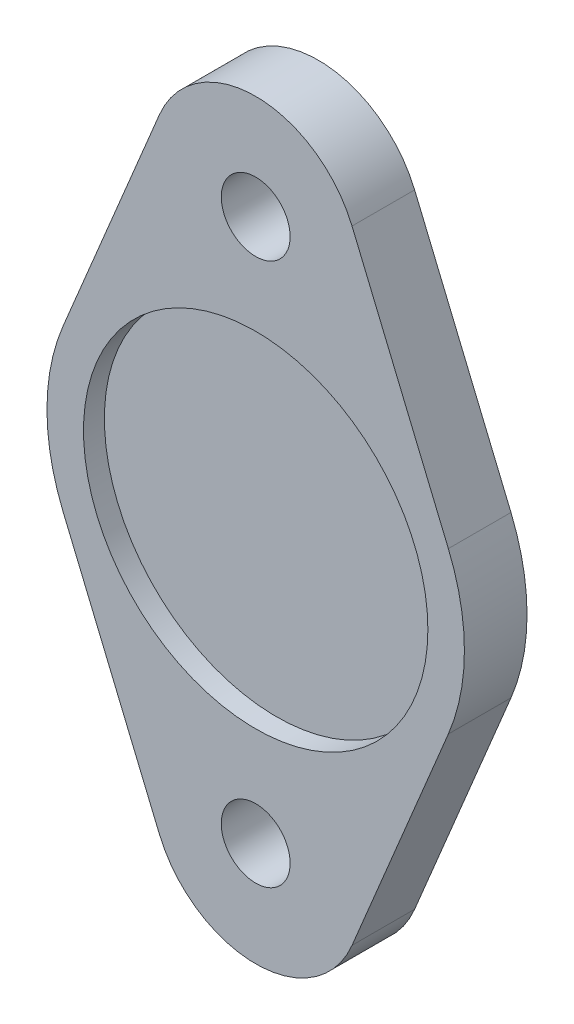
ISO-10303-21;
HEADER;
FILE_DESCRIPTION(('STEP AP214'),'2;1');
FILE_NAME('part.step','',(''),(''),'','','');
FILE_SCHEMA(('AUTOMOTIVE_DESIGN { 1 0 10303 214 1 1 1 1 }'));
ENDSEC;
DATA;
#1=APPLICATION_CONTEXT('core data for automotive mechanical design processes');
#2=APPLICATION_PROTOCOL_DEFINITION('international standard','automotive_design',2000,#1);
#3=PRODUCT_CONTEXT('',#1,'mechanical');
#4=PRODUCT('Part','Part','',(#3));
#5=PRODUCT_RELATED_PRODUCT_CATEGORY('part','',(#4));
#6=PRODUCT_DEFINITION_FORMATION('','',#4);
#7=PRODUCT_DEFINITION_CONTEXT('part definition',#1,'design');
#8=PRODUCT_DEFINITION('design','',#6,#7);
#9=PRODUCT_DEFINITION_SHAPE('','',#8);
#10=(LENGTH_UNIT() NAMED_UNIT(*) SI_UNIT(.MILLI.,.METRE.));
#11=(NAMED_UNIT(*) PLANE_ANGLE_UNIT() SI_UNIT($,.RADIAN.));
#12=(NAMED_UNIT(*) SI_UNIT($,.STERADIAN.) SOLID_ANGLE_UNIT());
#13=UNCERTAINTY_MEASURE_WITH_UNIT(LENGTH_MEASURE(1.E-05),#10,'distance_accuracy_value','');
#14=(GEOMETRIC_REPRESENTATION_CONTEXT(3) GLOBAL_UNCERTAINTY_ASSIGNED_CONTEXT((#13)) GLOBAL_UNIT_ASSIGNED_CONTEXT((#10,
#11,#12)) REPRESENTATION_CONTEXT('',''));
#15=CARTESIAN_POINT('',(0.,0.,0.));
#16=DIRECTION('',(0.,0.,1.));
#17=DIRECTION('',(1.,0.,0.));
#18=AXIS2_PLACEMENT_3D('',#15,#16,#17);
#19=CARTESIAN_POINT('',(0.,13.,3.));
#20=DIRECTION('',(0.,0.,-1.));
#21=DIRECTION('',(-1.,0.,0.));
#22=AXIS2_PLACEMENT_3D('',#19,#20,#21);
#23=CYLINDRICAL_SURFACE('',#22,5.);
#24=CARTESIAN_POINT('',(0.,13.,0.));
#25=DIRECTION('',(0.,0.,1.));
#26=DIRECTION('',(1.,0.,0.));
#27=AXIS2_PLACEMENT_3D('',#24,#25,#26);
#28=CIRCLE('',#27,5.);
#29=CARTESIAN_POINT('',(-4.61538461538462,14.9230769230769,0.));
#30=VERTEX_POINT('',#29);
#31=CARTESIAN_POINT('',(4.61538461538462,14.9230769230769,0.));
#32=VERTEX_POINT('',#31);
#33=EDGE_CURVE('E148',#30,#32,#28,.F.);
#34=ORIENTED_EDGE('',*,*,#33,.F.);
#35=DIRECTION('',(0.,0.,-1.));
#36=VECTOR('',#35,1.);
#37=CARTESIAN_POINT('',(-4.61538461538462,14.9230769230769,3.));
#38=LINE('',#37,#36);
#39=CARTESIAN_POINT('',(-4.61538461538462,14.9230769230769,3.));
#40=VERTEX_POINT('',#39);
#41=EDGE_CURVE('E45',#40,#30,#38,.T.);
#42=ORIENTED_EDGE('',*,*,#41,.F.);
#43=CARTESIAN_POINT('',(0.,13.,3.));
#44=DIRECTION('',(0.,0.,1.));
#45=DIRECTION('',(1.,0.,0.));
#46=AXIS2_PLACEMENT_3D('',#43,#44,#45);
#47=CIRCLE('',#46,5.);
#48=CARTESIAN_POINT('',(4.61538461538462,14.9230769230769,3.));
#49=VERTEX_POINT('',#48);
#50=EDGE_CURVE('E311',#40,#49,#47,.F.);
#51=ORIENTED_EDGE('',*,*,#50,.T.);
#52=DIRECTION('',(0.,0.,-1.));
#53=VECTOR('',#52,1.);
#54=CARTESIAN_POINT('',(4.61538461538462,14.9230769230769,3.));
#55=LINE('',#54,#53);
#56=EDGE_CURVE('E53',#49,#32,#55,.T.);
#57=ORIENTED_EDGE('',*,*,#56,.T.);
#58=EDGE_LOOP('',(#34,#42,#51,#57));
#59=FACE_BOUND('',#58,.T.);
#60=ADVANCED_FACE('F36',(#59),#23,.T.);
#61=CARTESIAN_POINT('',(-9.23076923076923,3.84615384615384,3.));
#62=DIRECTION('',(-0.923076923076923,0.384615384615384,0.));
#63=DIRECTION('',(-0.384615384615384,-0.923076923076923,0.));
#64=AXIS2_PLACEMENT_3D('',#61,#62,#63);
#65=PLANE('',#64);
#66=DIRECTION('',(0.384615384615384,0.923076923076923,0.));
#67=VECTOR('',#66,1.);
#68=CARTESIAN_POINT('',(-9.23076923076923,3.84615384615384,0.));
#69=LINE('',#68,#67);
#70=CARTESIAN_POINT('',(-9.23076923076923,3.84615384615384,0.));
#71=VERTEX_POINT('',#70);
#72=EDGE_CURVE('E145',#71,#30,#69,.T.);
#73=ORIENTED_EDGE('',*,*,#72,.F.);
#74=DIRECTION('',(0.,0.,-1.));
#75=VECTOR('',#74,1.);
#76=CARTESIAN_POINT('',(-9.23076923076923,3.84615384615384,3.));
#77=LINE('',#76,#75);
#78=CARTESIAN_POINT('',(-9.23076923076923,3.84615384615384,3.));
#79=VERTEX_POINT('',#78);
#80=EDGE_CURVE('E139',#79,#71,#77,.T.);
#81=ORIENTED_EDGE('',*,*,#80,.F.);
#82=DIRECTION('',(0.384615384615384,0.923076923076923,0.));
#83=VECTOR('',#82,1.);
#84=CARTESIAN_POINT('',(-9.23076923076923,3.84615384615384,3.));
#85=LINE('',#84,#83);
#86=EDGE_CURVE('E147',#79,#40,#85,.T.);
#87=ORIENTED_EDGE('',*,*,#86,.T.);
#88=ORIENTED_EDGE('',*,*,#41,.T.);
#89=EDGE_LOOP('',(#73,#81,#87,#88));
#90=FACE_BOUND('',#89,.T.);
#91=ADVANCED_FACE('F143',(#90),#65,.T.);
#92=CARTESIAN_POINT('',(0.,0.,3.));
#93=DIRECTION('',(0.,0.,-1.));
#94=DIRECTION('',(-1.,0.,0.));
#95=AXIS2_PLACEMENT_3D('',#92,#93,#94);
#96=CYLINDRICAL_SURFACE('',#95,10.);
#97=CARTESIAN_POINT('',(0.,0.,0.));
#98=DIRECTION('',(0.,0.,1.));
#99=DIRECTION('',(1.,0.,0.));
#100=AXIS2_PLACEMENT_3D('',#97,#98,#99);
#101=CIRCLE('',#100,10.);
#102=CARTESIAN_POINT('',(-9.23076923076923,-3.84615384615384,0.));
#103=VERTEX_POINT('',#102);
#104=EDGE_CURVE('E157',#71,#103,#101,.T.);
#105=ORIENTED_EDGE('',*,*,#104,.T.);
#106=DIRECTION('',(0.,0.,-1.));
#107=VECTOR('',#106,1.);
#108=CARTESIAN_POINT('',(-9.23076923076923,-3.84615384615384,3.));
#109=LINE('',#108,#107);
#110=CARTESIAN_POINT('',(-9.23076923076923,-3.84615384615384,3.));
#111=VERTEX_POINT('',#110);
#112=EDGE_CURVE('E136',#111,#103,#109,.T.);
#113=ORIENTED_EDGE('',*,*,#112,.F.);
#114=CARTESIAN_POINT('',(0.,0.,3.));
#115=DIRECTION('',(0.,0.,1.));
#116=DIRECTION('',(1.,0.,0.));
#117=AXIS2_PLACEMENT_3D('',#114,#115,#116);
#118=CIRCLE('',#117,10.);
#119=EDGE_CURVE('E115',#79,#111,#118,.T.);
#120=ORIENTED_EDGE('',*,*,#119,.F.);
#121=ORIENTED_EDGE('',*,*,#80,.T.);
#122=EDGE_LOOP('',(#105,#113,#120,#121));
#123=FACE_BOUND('',#122,.T.);
#124=ADVANCED_FACE('F204',(#123),#96,.T.);
#125=CARTESIAN_POINT('',(-9.23076923076923,-3.84615384615384,3.));
#126=DIRECTION('',(0.923076923076923,0.384615384615384,0.));
#127=DIRECTION('',(-0.384615384615384,0.923076923076923,0.));
#128=AXIS2_PLACEMENT_3D('',#125,#126,#127);
#129=PLANE('',#128);
#130=DIRECTION('',(0.384615384615384,-0.923076923076923,0.));
#131=VECTOR('',#130,1.);
#132=CARTESIAN_POINT('',(-9.23076923076923,-3.84615384615384,0.));
#133=LINE('',#132,#131);
#134=CARTESIAN_POINT('',(-4.61538461538462,-14.9230769230769,0.));
#135=VERTEX_POINT('',#134);
#136=EDGE_CURVE('E159',#103,#135,#133,.T.);
#137=ORIENTED_EDGE('',*,*,#136,.T.);
#138=DIRECTION('',(0.,0.,-1.));
#139=VECTOR('',#138,1.);
#140=CARTESIAN_POINT('',(-4.61538461538462,-14.9230769230769,3.));
#141=LINE('',#140,#139);
#142=CARTESIAN_POINT('',(-4.61538461538462,-14.9230769230769,3.));
#143=VERTEX_POINT('',#142);
#144=EDGE_CURVE('E129',#143,#135,#141,.T.);
#145=ORIENTED_EDGE('',*,*,#144,.F.);
#146=DIRECTION('',(0.384615384615384,-0.923076923076923,0.));
#147=VECTOR('',#146,1.);
#148=CARTESIAN_POINT('',(-9.23076923076923,-3.84615384615384,3.));
#149=LINE('',#148,#147);
#150=EDGE_CURVE('E310',#111,#143,#149,.T.);
#151=ORIENTED_EDGE('',*,*,#150,.F.);
#152=ORIENTED_EDGE('',*,*,#112,.T.);
#153=EDGE_LOOP('',(#137,#145,#151,#152));
#154=FACE_BOUND('',#153,.T.);
#155=ADVANCED_FACE('F207',(#154),#129,.F.);
#156=CARTESIAN_POINT('',(0.,-13.,3.));
#157=DIRECTION('',(0.,0.,-1.));
#158=DIRECTION('',(-1.,0.,0.));
#159=AXIS2_PLACEMENT_3D('',#156,#157,#158);
#160=CYLINDRICAL_SURFACE('',#159,5.);
#161=CARTESIAN_POINT('',(0.,-13.,0.));
#162=DIRECTION('',(0.,0.,1.));
#163=DIRECTION('',(1.,0.,0.));
#164=AXIS2_PLACEMENT_3D('',#161,#162,#163);
#165=CIRCLE('',#164,5.);
#166=CARTESIAN_POINT('',(4.61538461538462,-14.9230769230769,0.));
#167=VERTEX_POINT('',#166);
#168=EDGE_CURVE('E166',#135,#167,#165,.T.);
#169=ORIENTED_EDGE('',*,*,#168,.T.);
#170=DIRECTION('',(0.,0.,-1.));
#171=VECTOR('',#170,1.);
#172=CARTESIAN_POINT('',(4.61538461538462,-14.9230769230769,3.));
#173=LINE('',#172,#171);
#174=CARTESIAN_POINT('',(4.61538461538462,-14.9230769230769,3.));
#175=VERTEX_POINT('',#174);
#176=EDGE_CURVE('E127',#175,#167,#173,.T.);
#177=ORIENTED_EDGE('',*,*,#176,.F.);
#178=CARTESIAN_POINT('',(0.,-13.,3.));
#179=DIRECTION('',(0.,0.,1.));
#180=DIRECTION('',(1.,0.,0.));
#181=AXIS2_PLACEMENT_3D('',#178,#179,#180);
#182=CIRCLE('',#181,5.);
#183=EDGE_CURVE('E120',#143,#175,#182,.T.);
#184=ORIENTED_EDGE('',*,*,#183,.F.);
#185=ORIENTED_EDGE('',*,*,#144,.T.);
#186=EDGE_LOOP('',(#169,#177,#184,#185));
#187=FACE_BOUND('',#186,.T.);
#188=ADVANCED_FACE('F210',(#187),#160,.T.);
#189=CARTESIAN_POINT('',(9.23076923076923,-3.84615384615384,3.));
#190=DIRECTION('',(-0.923076923076923,0.384615384615384,0.));
#191=DIRECTION('',(-0.384615384615384,-0.923076923076923,0.));
#192=AXIS2_PLACEMENT_3D('',#189,#190,#191);
#193=PLANE('',#192);
#194=DIRECTION('',(0.384615384615384,0.923076923076923,0.));
#195=VECTOR('',#194,1.);
#196=CARTESIAN_POINT('',(9.23076923076923,-3.84615384615384,0.));
#197=LINE('',#196,#195);
#198=CARTESIAN_POINT('',(9.23076923076923,-3.84615384615384,0.));
#199=VERTEX_POINT('',#198);
#200=EDGE_CURVE('E126',#167,#199,#197,.T.);
#201=ORIENTED_EDGE('',*,*,#200,.T.);
#202=DIRECTION('',(0.,0.,-1.));
#203=VECTOR('',#202,1.);
#204=CARTESIAN_POINT('',(9.23076923076923,-3.84615384615384,3.));
#205=LINE('',#204,#203);
#206=CARTESIAN_POINT('',(9.23076923076923,-3.84615384615384,3.));
#207=VERTEX_POINT('',#206);
#208=EDGE_CURVE('E108',#207,#199,#205,.T.);
#209=ORIENTED_EDGE('',*,*,#208,.F.);
#210=DIRECTION('',(0.384615384615384,0.923076923076923,0.));
#211=VECTOR('',#210,1.);
#212=CARTESIAN_POINT('',(9.23076923076923,-3.84615384615384,3.));
#213=LINE('',#212,#211);
#214=EDGE_CURVE('E113',#175,#207,#213,.T.);
#215=ORIENTED_EDGE('',*,*,#214,.F.);
#216=ORIENTED_EDGE('',*,*,#176,.T.);
#217=EDGE_LOOP('',(#201,#209,#215,#216));
#218=FACE_BOUND('',#217,.T.);
#219=ADVANCED_FACE('F125',(#218),#193,.F.);
#220=CARTESIAN_POINT('',(9.23076923076923,3.84615384615384,0.));
#221=VERTEX_POINT('',#220);
#222=EDGE_CURVE('E161',#199,#221,#101,.T.);
#223=ORIENTED_EDGE('',*,*,#222,.T.);
#224=DIRECTION('',(0.,0.,-1.));
#225=VECTOR('',#224,1.);
#226=CARTESIAN_POINT('',(9.23076923076923,3.84615384615384,3.));
#227=LINE('',#226,#225);
#228=CARTESIAN_POINT('',(9.23076923076923,3.84615384615384,3.));
#229=VERTEX_POINT('',#228);
#230=EDGE_CURVE('E80',#229,#221,#227,.T.);
#231=ORIENTED_EDGE('',*,*,#230,.F.);
#232=EDGE_CURVE('E104',#207,#229,#118,.T.);
#233=ORIENTED_EDGE('',*,*,#232,.F.);
#234=ORIENTED_EDGE('',*,*,#208,.T.);
#235=EDGE_LOOP('',(#223,#231,#233,#234));
#236=FACE_BOUND('',#235,.T.);
#237=ADVANCED_FACE('F106',(#236),#96,.T.);
#238=CARTESIAN_POINT('',(0.,0.,3.));
#239=DIRECTION('',(0.,0.,-1.));
#240=DIRECTION('',(-1.,0.,0.));
#241=AXIS2_PLACEMENT_3D('',#238,#239,#240);
#242=CYLINDRICAL_SURFACE('',#241,8.25);
#243=CARTESIAN_POINT('',(0.,0.,2.));
#244=DIRECTION('',(0.,0.,1.));
#245=DIRECTION('',(1.,0.,0.));
#246=AXIS2_PLACEMENT_3D('',#243,#244,#245);
#247=CIRCLE('',#246,8.25);
#248=CARTESIAN_POINT('',(8.25,0.,2.));
#249=VERTEX_POINT('',#248);
#250=EDGE_CURVE('E11',#249,#249,#247,.T.);
#251=ORIENTED_EDGE('',*,*,#250,.F.);
#252=EDGE_LOOP('',(#251));
#253=FACE_BOUND('',#252,.T.);
#254=CARTESIAN_POINT('',(0.,0.,3.));
#255=DIRECTION('',(0.,0.,1.));
#256=DIRECTION('',(1.,0.,0.));
#257=AXIS2_PLACEMENT_3D('',#254,#255,#256);
#258=CIRCLE('',#257,8.25);
#259=CARTESIAN_POINT('',(8.25,0.,3.));
#260=VERTEX_POINT('',#259);
#261=EDGE_CURVE('E177',#260,#260,#258,.T.);
#262=ORIENTED_EDGE('',*,*,#261,.T.);
#263=EDGE_LOOP('',(#262));
#264=FACE_BOUND('',#263,.T.);
#265=ADVANCED_FACE('F197',(#253,#264),#242,.F.);
#266=CARTESIAN_POINT('',(9.23076923076923,3.84615384615384,3.));
#267=DIRECTION('',(0.923076923076923,0.384615384615384,0.));
#268=DIRECTION('',(-0.384615384615384,0.923076923076923,0.));
#269=AXIS2_PLACEMENT_3D('',#266,#267,#268);
#270=PLANE('',#269);
#271=DIRECTION('',(0.384615384615384,-0.923076923076923,0.));
#272=VECTOR('',#271,1.);
#273=CARTESIAN_POINT('',(9.23076923076923,3.84615384615384,0.));
#274=LINE('',#273,#272);
#275=EDGE_CURVE('E170',#32,#221,#274,.T.);
#276=ORIENTED_EDGE('',*,*,#275,.F.);
#277=ORIENTED_EDGE('',*,*,#56,.F.);
#278=DIRECTION('',(0.384615384615384,-0.923076923076923,0.));
#279=VECTOR('',#278,1.);
#280=CARTESIAN_POINT('',(9.23076923076923,3.84615384615384,3.));
#281=LINE('',#280,#279);
#282=EDGE_CURVE('E112',#49,#229,#281,.T.);
#283=ORIENTED_EDGE('',*,*,#282,.T.);
#284=ORIENTED_EDGE('',*,*,#230,.T.);
#285=EDGE_LOOP('',(#276,#277,#283,#284));
#286=FACE_BOUND('',#285,.T.);
#287=ADVANCED_FACE('F190',(#286),#270,.T.);
#288=CARTESIAN_POINT('',(0.,13.,3.));
#289=DIRECTION('',(0.,0.,-1.));
#290=DIRECTION('',(-1.,0.,0.));
#291=AXIS2_PLACEMENT_3D('',#288,#289,#290);
#292=CYLINDRICAL_SURFACE('',#291,1.65);
#293=CARTESIAN_POINT('',(0.,13.,3.));
#294=DIRECTION('',(0.,0.,1.));
#295=DIRECTION('',(1.,0.,0.));
#296=AXIS2_PLACEMENT_3D('',#293,#294,#295);
#297=CIRCLE('',#296,1.65);
#298=CARTESIAN_POINT('',(1.65,13.,3.));
#299=VERTEX_POINT('',#298);
#300=EDGE_CURVE('E174',#299,#299,#297,.T.);
#301=ORIENTED_EDGE('',*,*,#300,.T.);
#302=EDGE_LOOP('',(#301));
#303=FACE_BOUND('',#302,.T.);
#304=CARTESIAN_POINT('',(0.,13.,0.));
#305=DIRECTION('',(0.,0.,1.));
#306=DIRECTION('',(1.,0.,0.));
#307=AXIS2_PLACEMENT_3D('',#304,#305,#306);
#308=CIRCLE('',#307,1.65);
#309=CARTESIAN_POINT('',(1.65,13.,0.));
#310=VERTEX_POINT('',#309);
#311=EDGE_CURVE('E151',#310,#310,#308,.T.);
#312=ORIENTED_EDGE('',*,*,#311,.F.);
#313=EDGE_LOOP('',(#312));
#314=FACE_BOUND('',#313,.T.);
#315=ADVANCED_FACE('F38',(#303,#314),#292,.F.);
#316=CARTESIAN_POINT('',(0.,-13.,3.));
#317=DIRECTION('',(0.,0.,-1.));
#318=DIRECTION('',(-1.,0.,0.));
#319=AXIS2_PLACEMENT_3D('',#316,#317,#318);
#320=CYLINDRICAL_SURFACE('',#319,1.65);
#321=CARTESIAN_POINT('',(0.,-13.,3.));
#322=DIRECTION('',(0.,0.,1.));
#323=DIRECTION('',(1.,0.,0.));
#324=AXIS2_PLACEMENT_3D('',#321,#322,#323);
#325=CIRCLE('',#324,1.65);
#326=CARTESIAN_POINT('',(1.65,-13.,3.));
#327=VERTEX_POINT('',#326);
#328=EDGE_CURVE('E175',#327,#327,#325,.T.);
#329=ORIENTED_EDGE('',*,*,#328,.T.);
#330=EDGE_LOOP('',(#329));
#331=FACE_BOUND('',#330,.T.);
#332=CARTESIAN_POINT('',(0.,-13.,0.));
#333=DIRECTION('',(0.,0.,1.));
#334=DIRECTION('',(1.,0.,0.));
#335=AXIS2_PLACEMENT_3D('',#332,#333,#334);
#336=CIRCLE('',#335,1.65);
#337=CARTESIAN_POINT('',(1.65,-13.,0.));
#338=VERTEX_POINT('',#337);
#339=EDGE_CURVE('E172',#338,#338,#336,.T.);
#340=ORIENTED_EDGE('',*,*,#339,.F.);
#341=EDGE_LOOP('',(#340));
#342=FACE_BOUND('',#341,.T.);
#343=ADVANCED_FACE('F189',(#331,#342),#320,.F.);
#344=CARTESIAN_POINT('',(0.,0.,3.));
#345=DIRECTION('',(0.,0.,1.));
#346=DIRECTION('',(1.,0.,0.));
#347=AXIS2_PLACEMENT_3D('',#344,#345,#346);
#348=PLANE('',#347);
#349=ORIENTED_EDGE('',*,*,#300,.F.);
#350=EDGE_LOOP('',(#349));
#351=FACE_BOUND('',#350,.T.);
#352=ORIENTED_EDGE('',*,*,#50,.F.);
#353=ORIENTED_EDGE('',*,*,#86,.F.);
#354=ORIENTED_EDGE('',*,*,#119,.T.);
#355=ORIENTED_EDGE('',*,*,#150,.T.);
#356=ORIENTED_EDGE('',*,*,#183,.T.);
#357=ORIENTED_EDGE('',*,*,#214,.T.);
#358=ORIENTED_EDGE('',*,*,#232,.T.);
#359=ORIENTED_EDGE('',*,*,#282,.F.);
#360=EDGE_LOOP('',(#352,#353,#354,#355,#356,#357,#358,#359));
#361=FACE_BOUND('',#360,.T.);
#362=ORIENTED_EDGE('',*,*,#261,.F.);
#363=EDGE_LOOP('',(#362));
#364=FACE_BOUND('',#363,.T.);
#365=ORIENTED_EDGE('',*,*,#328,.F.);
#366=EDGE_LOOP('',(#365));
#367=FACE_BOUND('',#366,.T.);
#368=ADVANCED_FACE('F117',(#351,#361,#364,#367),#348,.T.);
#369=CARTESIAN_POINT('',(0.,0.,0.));
#370=DIRECTION('',(0.,0.,1.));
#371=DIRECTION('',(1.,0.,0.));
#372=AXIS2_PLACEMENT_3D('',#369,#370,#371);
#373=PLANE('',#372);
#374=ORIENTED_EDGE('',*,*,#311,.T.);
#375=EDGE_LOOP('',(#374));
#376=FACE_BOUND('',#375,.T.);
#377=ORIENTED_EDGE('',*,*,#33,.T.);
#378=ORIENTED_EDGE('',*,*,#275,.T.);
#379=ORIENTED_EDGE('',*,*,#222,.F.);
#380=ORIENTED_EDGE('',*,*,#200,.F.);
#381=ORIENTED_EDGE('',*,*,#168,.F.);
#382=ORIENTED_EDGE('',*,*,#136,.F.);
#383=ORIENTED_EDGE('',*,*,#104,.F.);
#384=ORIENTED_EDGE('',*,*,#72,.T.);
#385=EDGE_LOOP('',(#377,#378,#379,#380,#381,#382,#383,#384));
#386=FACE_BOUND('',#385,.T.);
#387=ORIENTED_EDGE('',*,*,#339,.T.);
#388=EDGE_LOOP('',(#387));
#389=FACE_BOUND('',#388,.T.);
#390=ADVANCED_FACE('F154',(#376,#386,#389),#373,.F.);
#391=CARTESIAN_POINT('',(0.,0.,2.));
#392=DIRECTION('',(0.,0.,1.));
#393=DIRECTION('',(1.,0.,0.));
#394=AXIS2_PLACEMENT_3D('',#391,#392,#393);
#395=PLANE('',#394);
#396=ORIENTED_EDGE('',*,*,#250,.T.);
#397=EDGE_LOOP('',(#396));
#398=FACE_BOUND('',#397,.T.);
#399=ADVANCED_FACE('F224',(#398),#395,.T.);
#400=CLOSED_SHELL('',(#60,#91,#124,#155,#188,#219,#237,#265,#287,#315,#343,#368,#390,#399));
#401=MANIFOLD_SOLID_BREP('B2',#400);
#402=ADVANCED_BREP_SHAPE_REPRESENTATION('',(#18,#401),#14);
#403=SHAPE_DEFINITION_REPRESENTATION(#9,#402);
ENDSEC;
END-ISO-10303-21;
